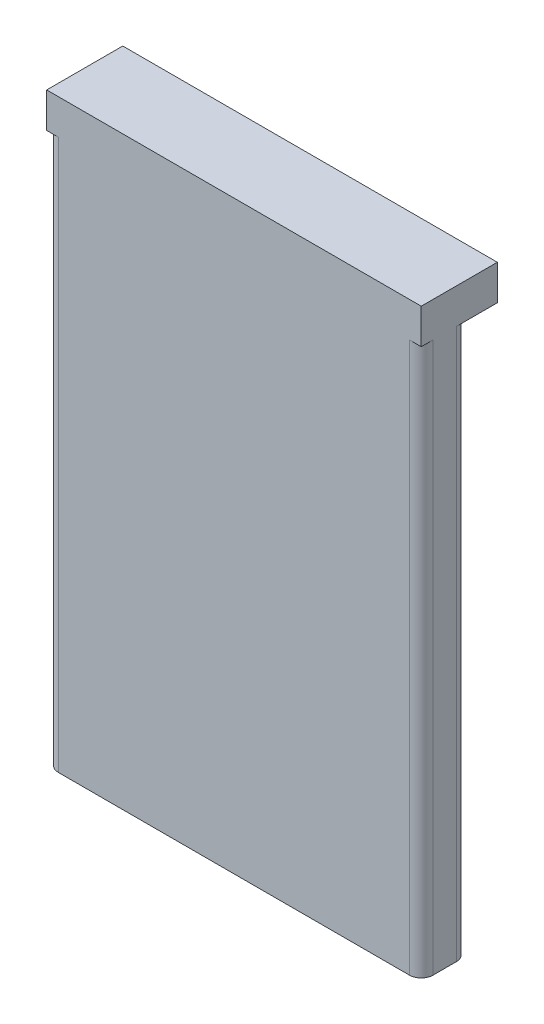
ISO-10303-21;
HEADER;
FILE_DESCRIPTION(('STEP AP214'),'2;1');
FILE_NAME('part.step','',(''),(''),'','','');
FILE_SCHEMA(('AUTOMOTIVE_DESIGN { 1 0 10303 214 1 1 1 1 }'));
ENDSEC;
DATA;
#1=APPLICATION_CONTEXT('core data for automotive mechanical design processes');
#2=APPLICATION_PROTOCOL_DEFINITION('international standard','automotive_design',2000,#1);
#3=PRODUCT_CONTEXT('',#1,'mechanical');
#4=PRODUCT('Part','Part','',(#3));
#5=PRODUCT_RELATED_PRODUCT_CATEGORY('part','',(#4));
#6=PRODUCT_DEFINITION_FORMATION('','',#4);
#7=PRODUCT_DEFINITION_CONTEXT('part definition',#1,'design');
#8=PRODUCT_DEFINITION('design','',#6,#7);
#9=PRODUCT_DEFINITION_SHAPE('','',#8);
#10=(LENGTH_UNIT() NAMED_UNIT(*) SI_UNIT(.MILLI.,.METRE.));
#11=(NAMED_UNIT(*) PLANE_ANGLE_UNIT() SI_UNIT($,.RADIAN.));
#12=(NAMED_UNIT(*) SI_UNIT($,.STERADIAN.) SOLID_ANGLE_UNIT());
#13=UNCERTAINTY_MEASURE_WITH_UNIT(LENGTH_MEASURE(1.E-05),#10,'distance_accuracy_value','');
#14=(GEOMETRIC_REPRESENTATION_CONTEXT(3) GLOBAL_UNCERTAINTY_ASSIGNED_CONTEXT((#13)) GLOBAL_UNIT_ASSIGNED_CONTEXT((#10,
#11,#12)) REPRESENTATION_CONTEXT('',''));
#15=CARTESIAN_POINT('',(0.,0.,0.));
#16=DIRECTION('',(0.,0.,1.));
#17=DIRECTION('',(1.,0.,0.));
#18=AXIS2_PLACEMENT_3D('',#15,#16,#17);
#19=CARTESIAN_POINT('',(-16.,50.,4.));
#20=DIRECTION('',(1.,0.,0.));
#21=DIRECTION('',(0.,1.,0.));
#22=AXIS2_PLACEMENT_3D('',#19,#20,#21);
#23=PLANE('',#22);
#24=DIRECTION('',(0.,-1.,0.));
#25=VECTOR('',#24,1.);
#26=CARTESIAN_POINT('',(-16.,50.,3.));
#27=LINE('',#26,#25);
#28=CARTESIAN_POINT('',(-16.,0.,3.));
#29=VERTEX_POINT('',#28);
#30=CARTESIAN_POINT('',(-16.,47.,3.));
#31=VERTEX_POINT('',#30);
#32=EDGE_CURVE('E128',#29,#31,#27,.F.);
#33=ORIENTED_EDGE('',*,*,#32,.T.);
#34=DIRECTION('',(0.,0.,1.));
#35=VECTOR('',#34,1.);
#36=CARTESIAN_POINT('',(-16.,47.,4.));
#37=LINE('',#36,#35);
#38=CARTESIAN_POINT('',(-16.,47.,4.));
#39=VERTEX_POINT('',#38);
#40=EDGE_CURVE('E123',#31,#39,#37,.T.);
#41=ORIENTED_EDGE('',*,*,#40,.T.);
#42=DIRECTION('',(0.,1.,0.));
#43=VECTOR('',#42,1.);
#44=CARTESIAN_POINT('',(-16.,47.,4.));
#45=LINE('',#44,#43);
#46=CARTESIAN_POINT('',(-16.,50.,4.));
#47=VERTEX_POINT('',#46);
#48=EDGE_CURVE('E125',#39,#47,#45,.T.);
#49=ORIENTED_EDGE('',*,*,#48,.T.);
#50=DIRECTION('',(0.,0.,-1.));
#51=VECTOR('',#50,1.);
#52=CARTESIAN_POINT('',(-16.,50.,4.));
#53=LINE('',#52,#51);
#54=CARTESIAN_POINT('',(-16.,50.,-2.5));
#55=VERTEX_POINT('',#54);
#56=EDGE_CURVE('E176',#47,#55,#53,.T.);
#57=ORIENTED_EDGE('',*,*,#56,.T.);
#58=DIRECTION('',(0.,1.,0.));
#59=VECTOR('',#58,1.);
#60=CARTESIAN_POINT('',(-16.,47.,-2.5));
#61=LINE('',#60,#59);
#62=CARTESIAN_POINT('',(-16.,47.,-2.5));
#63=VERTEX_POINT('',#62);
#64=EDGE_CURVE('E157',#63,#55,#61,.T.);
#65=ORIENTED_EDGE('',*,*,#64,.F.);
#66=CARTESIAN_POINT('',(-16.,47.,1.));
#67=VERTEX_POINT('',#66);
#68=EDGE_CURVE('E132',#63,#67,#37,.T.);
#69=ORIENTED_EDGE('',*,*,#68,.T.);
#70=DIRECTION('',(0.,-1.,0.));
#71=VECTOR('',#70,1.);
#72=CARTESIAN_POINT('',(-16.,50.,1.));
#73=LINE('',#72,#71);
#74=CARTESIAN_POINT('',(-16.,0.,1.));
#75=VERTEX_POINT('',#74);
#76=EDGE_CURVE('E189',#67,#75,#73,.T.);
#77=ORIENTED_EDGE('',*,*,#76,.T.);
#78=DIRECTION('',(0.,0.,-1.));
#79=VECTOR('',#78,1.);
#80=CARTESIAN_POINT('',(-16.,0.,4.));
#81=LINE('',#80,#79);
#82=EDGE_CURVE('E185',#29,#75,#81,.T.);
#83=ORIENTED_EDGE('',*,*,#82,.F.);
#84=EDGE_LOOP('',(#33,#41,#49,#57,#65,#69,#77,#83));
#85=FACE_BOUND('',#84,.T.);
#86=ADVANCED_FACE('F32',(#85),#23,.F.);
#87=CARTESIAN_POINT('',(-16.,0.,4.));
#88=DIRECTION('',(0.,1.,0.));
#89=DIRECTION('',(0.,0.,1.));
#90=AXIS2_PLACEMENT_3D('',#87,#88,#89);
#91=PLANE('',#90);
#92=ORIENTED_EDGE('',*,*,#82,.T.);
#93=CARTESIAN_POINT('',(-15.,0.,1.));
#94=DIRECTION('',(0.,1.,0.));
#95=DIRECTION('',(0.,0.,1.));
#96=AXIS2_PLACEMENT_3D('',#93,#94,#95);
#97=CIRCLE('',#96,1.);
#98=CARTESIAN_POINT('',(-15.,0.,0.));
#99=VERTEX_POINT('',#98);
#100=EDGE_CURVE('E196',#75,#99,#97,.F.);
#101=ORIENTED_EDGE('',*,*,#100,.T.);
#102=DIRECTION('',(1.,0.,0.));
#103=VECTOR('',#102,1.);
#104=CARTESIAN_POINT('',(-16.,0.,0.));
#105=LINE('',#104,#103);
#106=CARTESIAN_POINT('',(15.,0.,0.));
#107=VERTEX_POINT('',#106);
#108=EDGE_CURVE('E172',#99,#107,#105,.T.);
#109=ORIENTED_EDGE('',*,*,#108,.T.);
#110=CARTESIAN_POINT('',(15.,0.,1.));
#111=DIRECTION('',(0.,1.,0.));
#112=DIRECTION('',(0.,0.,1.));
#113=AXIS2_PLACEMENT_3D('',#110,#111,#112);
#114=CIRCLE('',#113,1.);
#115=CARTESIAN_POINT('',(16.,0.,1.));
#116=VERTEX_POINT('',#115);
#117=EDGE_CURVE('E192',#107,#116,#114,.F.);
#118=ORIENTED_EDGE('',*,*,#117,.T.);
#119=DIRECTION('',(0.,0.,-1.));
#120=VECTOR('',#119,1.);
#121=CARTESIAN_POINT('',(16.,0.,4.));
#122=LINE('',#121,#120);
#123=CARTESIAN_POINT('',(16.,0.,3.));
#124=VERTEX_POINT('',#123);
#125=EDGE_CURVE('E182',#124,#116,#122,.T.);
#126=ORIENTED_EDGE('',*,*,#125,.F.);
#127=CARTESIAN_POINT('',(15.,0.,3.));
#128=DIRECTION('',(0.,1.,0.));
#129=DIRECTION('',(0.,0.,1.));
#130=AXIS2_PLACEMENT_3D('',#127,#128,#129);
#131=CIRCLE('',#130,1.);
#132=CARTESIAN_POINT('',(15.,0.,4.));
#133=VERTEX_POINT('',#132);
#134=EDGE_CURVE('E47',#124,#133,#131,.F.);
#135=ORIENTED_EDGE('',*,*,#134,.T.);
#136=DIRECTION('',(1.,0.,0.));
#137=VECTOR('',#136,1.);
#138=CARTESIAN_POINT('',(-16.,0.,4.));
#139=LINE('',#138,#137);
#140=CARTESIAN_POINT('',(-15.,0.,4.));
#141=VERTEX_POINT('',#140);
#142=EDGE_CURVE('E173',#141,#133,#139,.T.);
#143=ORIENTED_EDGE('',*,*,#142,.F.);
#144=CARTESIAN_POINT('',(-15.,0.,3.));
#145=DIRECTION('',(0.,1.,0.));
#146=DIRECTION('',(0.,0.,1.));
#147=AXIS2_PLACEMENT_3D('',#144,#145,#146);
#148=CIRCLE('',#147,1.);
#149=EDGE_CURVE('E194',#141,#29,#148,.F.);
#150=ORIENTED_EDGE('',*,*,#149,.T.);
#151=EDGE_LOOP('',(#92,#101,#109,#118,#126,#135,#143,#150));
#152=FACE_BOUND('',#151,.T.);
#153=ADVANCED_FACE('F245',(#152),#91,.F.);
#154=CARTESIAN_POINT('',(16.,0.,4.));
#155=DIRECTION('',(-1.,0.,0.));
#156=DIRECTION('',(0.,-1.,0.));
#157=AXIS2_PLACEMENT_3D('',#154,#155,#156);
#158=PLANE('',#157);
#159=DIRECTION('',(0.,1.,0.));
#160=VECTOR('',#159,1.);
#161=CARTESIAN_POINT('',(16.,0.,1.));
#162=LINE('',#161,#160);
#163=CARTESIAN_POINT('',(16.,47.,1.));
#164=VERTEX_POINT('',#163);
#165=EDGE_CURVE('E40',#116,#164,#162,.T.);
#166=ORIENTED_EDGE('',*,*,#165,.T.);
#167=DIRECTION('',(0.,0.,-1.));
#168=VECTOR('',#167,1.);
#169=CARTESIAN_POINT('',(16.,47.,4.));
#170=LINE('',#169,#168);
#171=CARTESIAN_POINT('',(16.,47.,-2.5));
#172=VERTEX_POINT('',#171);
#173=EDGE_CURVE('E146',#164,#172,#170,.T.);
#174=ORIENTED_EDGE('',*,*,#173,.T.);
#175=DIRECTION('',(0.,1.,0.));
#176=VECTOR('',#175,1.);
#177=CARTESIAN_POINT('',(16.,47.,-2.5));
#178=LINE('',#177,#176);
#179=CARTESIAN_POINT('',(16.,50.,-2.5));
#180=VERTEX_POINT('',#179);
#181=EDGE_CURVE('E161',#172,#180,#178,.T.);
#182=ORIENTED_EDGE('',*,*,#181,.T.);
#183=DIRECTION('',(0.,0.,-1.));
#184=VECTOR('',#183,1.);
#185=CARTESIAN_POINT('',(16.,50.,4.));
#186=LINE('',#185,#184);
#187=CARTESIAN_POINT('',(16.,50.,4.));
#188=VERTEX_POINT('',#187);
#189=EDGE_CURVE('E180',#188,#180,#186,.T.);
#190=ORIENTED_EDGE('',*,*,#189,.F.);
#191=DIRECTION('',(0.,1.,0.));
#192=VECTOR('',#191,1.);
#193=CARTESIAN_POINT('',(16.,47.,4.));
#194=LINE('',#193,#192);
#195=CARTESIAN_POINT('',(16.,47.,4.));
#196=VERTEX_POINT('',#195);
#197=EDGE_CURVE('E141',#196,#188,#194,.T.);
#198=ORIENTED_EDGE('',*,*,#197,.F.);
#199=CARTESIAN_POINT('',(16.,47.,3.));
#200=VERTEX_POINT('',#199);
#201=EDGE_CURVE('E149',#196,#200,#170,.T.);
#202=ORIENTED_EDGE('',*,*,#201,.T.);
#203=DIRECTION('',(0.,1.,0.));
#204=VECTOR('',#203,1.);
#205=CARTESIAN_POINT('',(16.,0.,3.));
#206=LINE('',#205,#204);
#207=EDGE_CURVE('E206',#200,#124,#206,.F.);
#208=ORIENTED_EDGE('',*,*,#207,.T.);
#209=ORIENTED_EDGE('',*,*,#125,.T.);
#210=EDGE_LOOP('',(#166,#174,#182,#190,#198,#202,#208,#209));
#211=FACE_BOUND('',#210,.T.);
#212=ADVANCED_FACE('F210',(#211),#158,.F.);
#213=CARTESIAN_POINT('',(16.,50.,4.));
#214=DIRECTION('',(0.,-1.,0.));
#215=DIRECTION('',(0.,0.,-1.));
#216=AXIS2_PLACEMENT_3D('',#213,#214,#215);
#217=PLANE('',#216);
#218=DIRECTION('',(-1.,0.,0.));
#219=VECTOR('',#218,1.);
#220=CARTESIAN_POINT('',(-16.,50.,-2.5));
#221=LINE('',#220,#219);
#222=EDGE_CURVE('E133',#180,#55,#221,.T.);
#223=ORIENTED_EDGE('',*,*,#222,.T.);
#224=ORIENTED_EDGE('',*,*,#56,.F.);
#225=DIRECTION('',(-1.,0.,0.));
#226=VECTOR('',#225,1.);
#227=CARTESIAN_POINT('',(16.,50.,4.));
#228=LINE('',#227,#226);
#229=EDGE_CURVE('E140',#188,#47,#228,.T.);
#230=ORIENTED_EDGE('',*,*,#229,.F.);
#231=ORIENTED_EDGE('',*,*,#189,.T.);
#232=EDGE_LOOP('',(#223,#224,#230,#231));
#233=FACE_BOUND('',#232,.T.);
#234=ADVANCED_FACE('F235',(#233),#217,.F.);
#235=CARTESIAN_POINT('',(-16.,0.,4.));
#236=DIRECTION('',(0.,0.,1.));
#237=DIRECTION('',(1.,0.,0.));
#238=AXIS2_PLACEMENT_3D('',#235,#236,#237);
#239=PLANE('',#238);
#240=DIRECTION('',(0.,1.,0.));
#241=VECTOR('',#240,1.);
#242=CARTESIAN_POINT('',(15.,50.,4.));
#243=LINE('',#242,#241);
#244=CARTESIAN_POINT('',(15.,47.,4.));
#245=VERTEX_POINT('',#244);
#246=EDGE_CURVE('E203',#133,#245,#243,.T.);
#247=ORIENTED_EDGE('',*,*,#246,.T.);
#248=DIRECTION('',(1.,0.,0.));
#249=VECTOR('',#248,1.);
#250=CARTESIAN_POINT('',(-16.,47.,4.));
#251=LINE('',#250,#249);
#252=EDGE_CURVE('E147',#245,#196,#251,.T.);
#253=ORIENTED_EDGE('',*,*,#252,.T.);
#254=ORIENTED_EDGE('',*,*,#197,.T.);
#255=ORIENTED_EDGE('',*,*,#229,.T.);
#256=ORIENTED_EDGE('',*,*,#48,.F.);
#257=CARTESIAN_POINT('',(-15.,47.,4.));
#258=VERTEX_POINT('',#257);
#259=EDGE_CURVE('E138',#39,#258,#251,.T.);
#260=ORIENTED_EDGE('',*,*,#259,.T.);
#261=DIRECTION('',(0.,-1.,0.));
#262=VECTOR('',#261,1.);
#263=CARTESIAN_POINT('',(-15.,0.,4.));
#264=LINE('',#263,#262);
#265=EDGE_CURVE('E54',#258,#141,#264,.T.);
#266=ORIENTED_EDGE('',*,*,#265,.T.);
#267=ORIENTED_EDGE('',*,*,#142,.T.);
#268=EDGE_LOOP('',(#247,#253,#254,#255,#256,#260,#266,#267));
#269=FACE_BOUND('',#268,.T.);
#270=ADVANCED_FACE('F137',(#269),#239,.T.);
#271=CARTESIAN_POINT('',(-16.,0.,0.));
#272=DIRECTION('',(0.,0.,1.));
#273=DIRECTION('',(1.,0.,0.));
#274=AXIS2_PLACEMENT_3D('',#271,#272,#273);
#275=PLANE('',#274);
#276=DIRECTION('',(0.,-1.,0.));
#277=VECTOR('',#276,1.);
#278=CARTESIAN_POINT('',(-15.,0.,0.));
#279=LINE('',#278,#277);
#280=CARTESIAN_POINT('',(-15.,47.,0.));
#281=VERTEX_POINT('',#280);
#282=EDGE_CURVE('E200',#99,#281,#279,.F.);
#283=ORIENTED_EDGE('',*,*,#282,.T.);
#284=DIRECTION('',(1.,0.,0.));
#285=VECTOR('',#284,1.);
#286=CARTESIAN_POINT('',(-16.,47.,0.));
#287=LINE('',#286,#285);
#288=CARTESIAN_POINT('',(15.,47.,0.));
#289=VERTEX_POINT('',#288);
#290=EDGE_CURVE('E166',#281,#289,#287,.T.);
#291=ORIENTED_EDGE('',*,*,#290,.T.);
#292=DIRECTION('',(0.,1.,0.));
#293=VECTOR('',#292,1.);
#294=CARTESIAN_POINT('',(15.,0.,0.));
#295=LINE('',#294,#293);
#296=EDGE_CURVE('E198',#289,#107,#295,.F.);
#297=ORIENTED_EDGE('',*,*,#296,.T.);
#298=ORIENTED_EDGE('',*,*,#108,.F.);
#299=EDGE_LOOP('',(#283,#291,#297,#298));
#300=FACE_BOUND('',#299,.T.);
#301=ADVANCED_FACE('F222',(#300),#275,.F.);
#302=CARTESIAN_POINT('',(-15.,50.,1.));
#303=DIRECTION('',(0.,-1.,0.));
#304=DIRECTION('',(1.,0.,0.));
#305=AXIS2_PLACEMENT_3D('',#302,#303,#304);
#306=CYLINDRICAL_SURFACE('',#305,1.);
#307=CARTESIAN_POINT('',(-15.,47.,1.));
#308=DIRECTION('',(0.,-1.,0.));
#309=DIRECTION('',(0.,0.,-1.));
#310=AXIS2_PLACEMENT_3D('',#307,#308,#309);
#311=CIRCLE('',#310,1.);
#312=EDGE_CURVE('E169',#281,#67,#311,.F.);
#313=ORIENTED_EDGE('',*,*,#312,.F.);
#314=ORIENTED_EDGE('',*,*,#282,.F.);
#315=ORIENTED_EDGE('',*,*,#100,.F.);
#316=ORIENTED_EDGE('',*,*,#76,.F.);
#317=EDGE_LOOP('',(#313,#314,#315,#316));
#318=FACE_BOUND('',#317,.T.);
#319=ADVANCED_FACE('F227',(#318),#306,.T.);
#320=CARTESIAN_POINT('',(-15.,0.,3.));
#321=DIRECTION('',(0.,1.,0.));
#322=DIRECTION('',(-1.,0.,0.));
#323=AXIS2_PLACEMENT_3D('',#320,#321,#322);
#324=CYLINDRICAL_SURFACE('',#323,1.);
#325=CARTESIAN_POINT('',(-15.,47.,3.));
#326=DIRECTION('',(0.,-1.,0.));
#327=DIRECTION('',(0.,0.,-1.));
#328=AXIS2_PLACEMENT_3D('',#325,#326,#327);
#329=CIRCLE('',#328,1.);
#330=EDGE_CURVE('E145',#31,#258,#329,.F.);
#331=ORIENTED_EDGE('',*,*,#330,.F.);
#332=ORIENTED_EDGE('',*,*,#32,.F.);
#333=ORIENTED_EDGE('',*,*,#149,.F.);
#334=ORIENTED_EDGE('',*,*,#265,.F.);
#335=EDGE_LOOP('',(#331,#332,#333,#334));
#336=FACE_BOUND('',#335,.T.);
#337=ADVANCED_FACE('F247',(#336),#324,.T.);
#338=CARTESIAN_POINT('',(15.,0.,1.));
#339=DIRECTION('',(0.,1.,0.));
#340=DIRECTION('',(-1.,0.,0.));
#341=AXIS2_PLACEMENT_3D('',#338,#339,#340);
#342=CYLINDRICAL_SURFACE('',#341,1.);
#343=CARTESIAN_POINT('',(15.,47.,1.));
#344=DIRECTION('',(0.,-1.,0.));
#345=DIRECTION('',(0.,0.,-1.));
#346=AXIS2_PLACEMENT_3D('',#343,#344,#345);
#347=CIRCLE('',#346,1.);
#348=EDGE_CURVE('E160',#164,#289,#347,.F.);
#349=ORIENTED_EDGE('',*,*,#348,.F.);
#350=ORIENTED_EDGE('',*,*,#165,.F.);
#351=ORIENTED_EDGE('',*,*,#117,.F.);
#352=ORIENTED_EDGE('',*,*,#296,.F.);
#353=EDGE_LOOP('',(#349,#350,#351,#352));
#354=FACE_BOUND('',#353,.T.);
#355=ADVANCED_FACE('F215',(#354),#342,.T.);
#356=CARTESIAN_POINT('',(15.,0.,3.));
#357=DIRECTION('',(0.,-1.,0.));
#358=DIRECTION('',(1.,0.,0.));
#359=AXIS2_PLACEMENT_3D('',#356,#357,#358);
#360=CYLINDRICAL_SURFACE('',#359,1.);
#361=CARTESIAN_POINT('',(15.,47.,3.));
#362=DIRECTION('',(0.,-1.,0.));
#363=DIRECTION('',(0.,0.,-1.));
#364=AXIS2_PLACEMENT_3D('',#361,#362,#363);
#365=CIRCLE('',#364,1.);
#366=EDGE_CURVE('E11',#245,#200,#365,.F.);
#367=ORIENTED_EDGE('',*,*,#366,.F.);
#368=ORIENTED_EDGE('',*,*,#246,.F.);
#369=ORIENTED_EDGE('',*,*,#134,.F.);
#370=ORIENTED_EDGE('',*,*,#207,.F.);
#371=EDGE_LOOP('',(#367,#368,#369,#370));
#372=FACE_BOUND('',#371,.T.);
#373=ADVANCED_FACE('F34',(#372),#360,.T.);
#374=CARTESIAN_POINT('',(-16.,47.,-2.5));
#375=DIRECTION('',(0.,-1.,0.));
#376=DIRECTION('',(0.,0.,-1.));
#377=AXIS2_PLACEMENT_3D('',#374,#375,#376);
#378=PLANE('',#377);
#379=ORIENTED_EDGE('',*,*,#252,.F.);
#380=ORIENTED_EDGE('',*,*,#366,.T.);
#381=ORIENTED_EDGE('',*,*,#201,.F.);
#382=EDGE_LOOP('',(#379,#380,#381));
#383=FACE_BOUND('',#382,.T.);
#384=ADVANCED_FACE('F242',(#383),#378,.T.);
#385=CARTESIAN_POINT('',(-16.,47.,-2.5));
#386=DIRECTION('',(0.,0.,-1.));
#387=DIRECTION('',(-1.,0.,0.));
#388=AXIS2_PLACEMENT_3D('',#385,#386,#387);
#389=PLANE('',#388);
#390=ORIENTED_EDGE('',*,*,#222,.F.);
#391=ORIENTED_EDGE('',*,*,#181,.F.);
#392=DIRECTION('',(-1.,0.,0.));
#393=VECTOR('',#392,1.);
#394=CARTESIAN_POINT('',(-16.,47.,-2.5));
#395=LINE('',#394,#393);
#396=EDGE_CURVE('E142',#172,#63,#395,.T.);
#397=ORIENTED_EDGE('',*,*,#396,.T.);
#398=ORIENTED_EDGE('',*,*,#64,.T.);
#399=EDGE_LOOP('',(#390,#391,#397,#398));
#400=FACE_BOUND('',#399,.T.);
#401=ADVANCED_FACE('F233',(#400),#389,.T.);
#402=ORIENTED_EDGE('',*,*,#290,.F.);
#403=ORIENTED_EDGE('',*,*,#312,.T.);
#404=ORIENTED_EDGE('',*,*,#68,.F.);
#405=ORIENTED_EDGE('',*,*,#396,.F.);
#406=ORIENTED_EDGE('',*,*,#173,.F.);
#407=ORIENTED_EDGE('',*,*,#348,.T.);
#408=EDGE_LOOP('',(#402,#403,#404,#405,#406,#407));
#409=FACE_BOUND('',#408,.T.);
#410=ADVANCED_FACE('F218',(#409),#378,.T.);
#411=ORIENTED_EDGE('',*,*,#40,.F.);
#412=ORIENTED_EDGE('',*,*,#330,.T.);
#413=ORIENTED_EDGE('',*,*,#259,.F.);
#414=EDGE_LOOP('',(#411,#412,#413));
#415=FACE_BOUND('',#414,.T.);
#416=ADVANCED_FACE('F144',(#415),#378,.T.);
#417=CLOSED_SHELL('',(#86,#153,#212,#234,#270,#301,#319,#337,#355,#373,#384,#401,#410,#416));
#418=MANIFOLD_SOLID_BREP('B2',#417);
#419=ADVANCED_BREP_SHAPE_REPRESENTATION('',(#18,#418),#14);
#420=SHAPE_DEFINITION_REPRESENTATION(#9,#419);
ENDSEC;
END-ISO-10303-21;
